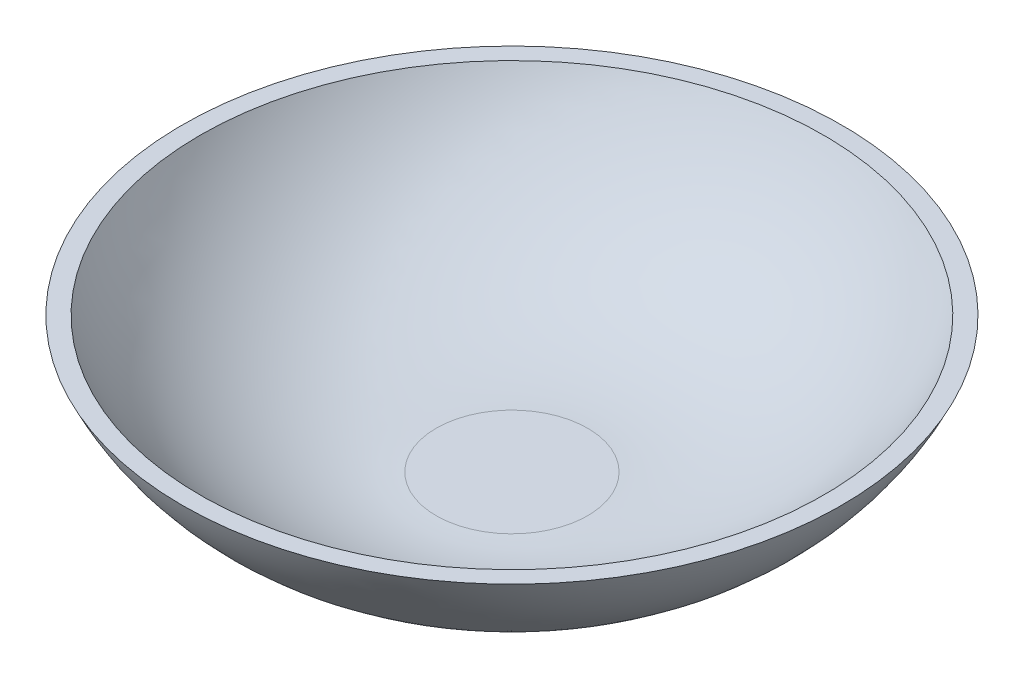
ISO-10303-21;
HEADER;
FILE_DESCRIPTION(('STEP AP214'),'2;1');
FILE_NAME('part.step','',(''),(''),'','','');
FILE_SCHEMA(('AUTOMOTIVE_DESIGN { 1 0 10303 214 1 1 1 1 }'));
ENDSEC;
DATA;
#1=APPLICATION_CONTEXT('core data for automotive mechanical design processes');
#2=APPLICATION_PROTOCOL_DEFINITION('international standard','automotive_design',2000,#1);
#3=PRODUCT_CONTEXT('',#1,'mechanical');
#4=PRODUCT('Part','Part','',(#3));
#5=PRODUCT_RELATED_PRODUCT_CATEGORY('part','',(#4));
#6=PRODUCT_DEFINITION_FORMATION('','',#4);
#7=PRODUCT_DEFINITION_CONTEXT('part definition',#1,'design');
#8=PRODUCT_DEFINITION('design','',#6,#7);
#9=PRODUCT_DEFINITION_SHAPE('','',#8);
#10=(LENGTH_UNIT() NAMED_UNIT(*) SI_UNIT(.MILLI.,.METRE.));
#11=(NAMED_UNIT(*) PLANE_ANGLE_UNIT() SI_UNIT($,.RADIAN.));
#12=(NAMED_UNIT(*) SI_UNIT($,.STERADIAN.) SOLID_ANGLE_UNIT());
#13=UNCERTAINTY_MEASURE_WITH_UNIT(LENGTH_MEASURE(1.E-05),#10,'distance_accuracy_value','');
#14=(GEOMETRIC_REPRESENTATION_CONTEXT(3) GLOBAL_UNCERTAINTY_ASSIGNED_CONTEXT((#13)) GLOBAL_UNIT_ASSIGNED_CONTEXT((#10,
#11,#12)) REPRESENTATION_CONTEXT('',''));
#15=CARTESIAN_POINT('',(0.,0.,0.));
#16=DIRECTION('',(0.,0.,1.));
#17=DIRECTION('',(1.,0.,0.));
#18=AXIS2_PLACEMENT_3D('',#15,#16,#17);
#19=CARTESIAN_POINT('',(0.,0.,0.));
#20=DIRECTION('',(0.,1.,0.));
#21=DIRECTION('',(0.,0.,1.));
#22=AXIS2_PLACEMENT_3D('',#19,#20,#21);
#23=PLANE('',#22);
#24=CARTESIAN_POINT('',(0.,0.,0.));
#25=DIRECTION('',(0.,1.,0.));
#26=DIRECTION('',(0.,0.,1.));
#27=AXIS2_PLACEMENT_3D('',#24,#25,#26);
#28=CIRCLE('',#27,16.5);
#29=CARTESIAN_POINT('',(0.,0.,16.5));
#30=VERTEX_POINT('',#29);
#31=EDGE_CURVE('E10',#30,#30,#28,.T.);
#32=ORIENTED_EDGE('',*,*,#31,.F.);
#33=EDGE_LOOP('',(#32));
#34=FACE_BOUND('',#33,.T.);
#35=ADVANCED_FACE('F41',(#34),#23,.F.);
#36=CARTESIAN_POINT('',(0.,43.3795500232021,0.));
#37=DIRECTION('',(0.,1.,0.));
#38=DIRECTION('',(0.,0.,1.));
#39=AXIS2_PLACEMENT_3D('',#36,#37,#38);
#40=DEGENERATE_TOROIDAL_SURFACE('',#39,16.2054166517935,43.3805502450641,.T.);
#41=CARTESIAN_POINT('',(0.,25.,0.));
#42=DIRECTION('',(0.,1.,0.));
#43=DIRECTION('',(0.,0.,1.));
#44=AXIS2_PLACEMENT_3D('',#41,#42,#43);
#45=CIRCLE('',#44,55.5);
#46=CARTESIAN_POINT('',(0.,25.,55.5));
#47=VERTEX_POINT('',#46);
#48=EDGE_CURVE('E48',#47,#47,#45,.T.);
#49=ORIENTED_EDGE('',*,*,#48,.F.);
#50=EDGE_LOOP('',(#49));
#51=FACE_BOUND('',#50,.T.);
#52=ORIENTED_EDGE('',*,*,#31,.T.);
#53=EDGE_LOOP('',(#52));
#54=FACE_BOUND('',#53,.T.);
#55=ADVANCED_FACE('F71',(#51,#54),#40,.T.);
#56=CARTESIAN_POINT('',(0.,25.,0.));
#57=DIRECTION('',(0.,-1.,0.));
#58=DIRECTION('',(0.,0.,-1.));
#59=AXIS2_PLACEMENT_3D('',#56,#57,#58);
#60=PLANE('',#59);
#61=CARTESIAN_POINT('',(0.,25.,0.));
#62=DIRECTION('',(0.,1.,0.));
#63=DIRECTION('',(-1.,0.,0.));
#64=AXIS2_PLACEMENT_3D('',#61,#62,#63);
#65=CIRCLE('',#64,52.5);
#66=CARTESIAN_POINT('',(-52.5,24.9999999999999,0.));
#67=VERTEX_POINT('',#66);
#68=EDGE_CURVE('E58',#67,#67,#65,.T.);
#69=ORIENTED_EDGE('',*,*,#68,.F.);
#70=EDGE_LOOP('',(#69));
#71=FACE_BOUND('',#70,.T.);
#72=ORIENTED_EDGE('',*,*,#48,.T.);
#73=EDGE_LOOP('',(#72));
#74=FACE_BOUND('',#73,.T.);
#75=ADVANCED_FACE('F68',(#71,#74),#60,.F.);
#76=CARTESIAN_POINT('',(0.,2.1245960517885,0.));
#77=DIRECTION('',(0.,1.,0.));
#78=DIRECTION('',(-1.,0.,0.));
#79=AXIS2_PLACEMENT_3D('',#76,#77,#78);
#80=PLANE('',#79);
#81=CARTESIAN_POINT('',(0.,2.1245960517885,0.));
#82=DIRECTION('',(0.,1.,0.));
#83=DIRECTION('',(-1.,0.,0.));
#84=AXIS2_PLACEMENT_3D('',#81,#82,#83);
#85=CIRCLE('',#84,12.7618716674151);
#86=CARTESIAN_POINT('',(-12.7618716674151,2.12459605178849,0.));
#87=VERTEX_POINT('',#86);
#88=EDGE_CURVE('E53',#87,#87,#85,.T.);
#89=ORIENTED_EDGE('',*,*,#88,.T.);
#90=EDGE_LOOP('',(#89));
#91=FACE_BOUND('',#90,.T.);
#92=ADVANCED_FACE('F70',(#91),#80,.T.);
#93=CARTESIAN_POINT('',(0.,45.4793471233732,0.));
#94=DIRECTION('',(0.,1.,0.));
#95=DIRECTION('',(-1.,0.,0.));
#96=AXIS2_PLACEMENT_3D('',#93,#94,#95);
#97=DEGENERATE_TOROIDAL_SURFACE('',#96,14.2577657430306,43.3805502450642,.T.);
#98=ORIENTED_EDGE('',*,*,#68,.T.);
#99=EDGE_LOOP('',(#98));
#100=FACE_BOUND('',#99,.T.);
#101=ORIENTED_EDGE('',*,*,#88,.F.);
#102=EDGE_LOOP('',(#101));
#103=FACE_BOUND('',#102,.T.);
#104=ADVANCED_FACE('F65',(#100,#103),#97,.F.);
#105=CLOSED_SHELL('',(#35,#55,#75,#92,#104));
#106=MANIFOLD_SOLID_BREP('B2',#105);
#107=ADVANCED_BREP_SHAPE_REPRESENTATION('',(#18,#106),#14);
#108=SHAPE_DEFINITION_REPRESENTATION(#9,#107);
ENDSEC;
END-ISO-10303-21;
